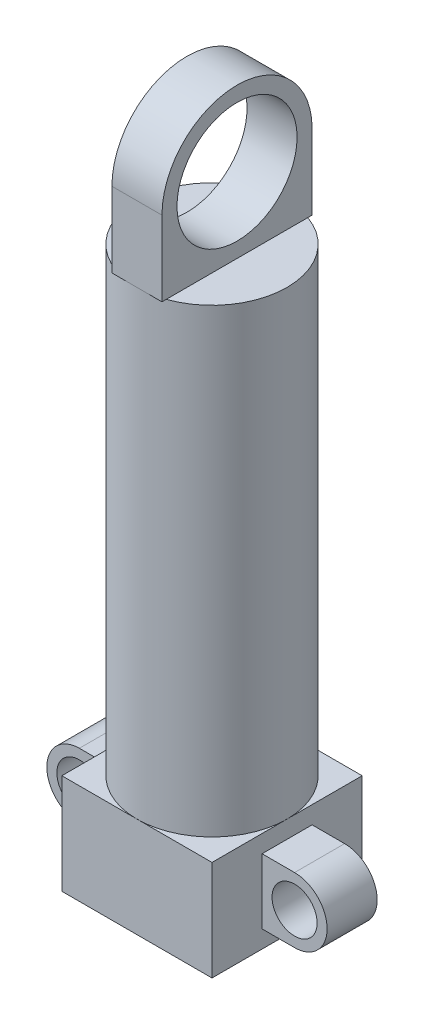
ISO-10303-21;
HEADER;
FILE_DESCRIPTION(('STEP AP214'),'2;1');
FILE_NAME('part.step','',(''),(''),'','','');
FILE_SCHEMA(('AUTOMOTIVE_DESIGN { 1 0 10303 214 1 1 1 1 }'));
ENDSEC;
DATA;
#1=APPLICATION_CONTEXT('core data for automotive mechanical design processes');
#2=APPLICATION_PROTOCOL_DEFINITION('international standard','automotive_design',2000,#1);
#3=PRODUCT_CONTEXT('',#1,'mechanical');
#4=PRODUCT('Part','Part','',(#3));
#5=PRODUCT_RELATED_PRODUCT_CATEGORY('part','',(#4));
#6=PRODUCT_DEFINITION_FORMATION('','',#4);
#7=PRODUCT_DEFINITION_CONTEXT('part definition',#1,'design');
#8=PRODUCT_DEFINITION('design','',#6,#7);
#9=PRODUCT_DEFINITION_SHAPE('','',#8);
#10=(LENGTH_UNIT() NAMED_UNIT(*) SI_UNIT(.MILLI.,.METRE.));
#11=(NAMED_UNIT(*) PLANE_ANGLE_UNIT() SI_UNIT($,.RADIAN.));
#12=(NAMED_UNIT(*) SI_UNIT($,.STERADIAN.) SOLID_ANGLE_UNIT());
#13=UNCERTAINTY_MEASURE_WITH_UNIT(LENGTH_MEASURE(1.E-05),#10,'distance_accuracy_value','');
#14=(GEOMETRIC_REPRESENTATION_CONTEXT(3) GLOBAL_UNCERTAINTY_ASSIGNED_CONTEXT((#13)) GLOBAL_UNIT_ASSIGNED_CONTEXT((#10,
#11,#12)) REPRESENTATION_CONTEXT('',''));
#15=CARTESIAN_POINT('',(0.,0.,0.));
#16=DIRECTION('',(0.,0.,1.));
#17=DIRECTION('',(1.,0.,0.));
#18=AXIS2_PLACEMENT_3D('',#15,#16,#17);
#19=CARTESIAN_POINT('',(0.,61.,-7.5));
#20=DIRECTION('',(0.,0.,1.));
#21=DIRECTION('',(1.,0.,0.));
#22=AXIS2_PLACEMENT_3D('',#19,#20,#21);
#23=PLANE('',#22);
#24=DIRECTION('',(0.,1.,0.));
#25=VECTOR('',#24,1.);
#26=CARTESIAN_POINT('',(2.5,0.,-7.5));
#27=LINE('',#26,#25);
#28=CARTESIAN_POINT('',(2.5,46.,-7.5));
#29=VERTEX_POINT('',#28);
#30=CARTESIAN_POINT('',(2.5,53.5,-7.5));
#31=VERTEX_POINT('',#30);
#32=EDGE_CURVE('E285',#29,#31,#27,.T.);
#33=ORIENTED_EDGE('',*,*,#32,.F.);
#34=DIRECTION('',(-1.,0.,0.));
#35=VECTOR('',#34,1.);
#36=CARTESIAN_POINT('',(0.,46.,-7.5));
#37=LINE('',#36,#35);
#38=CARTESIAN_POINT('',(0.,46.,-7.5));
#39=VERTEX_POINT('',#38);
#40=EDGE_CURVE('E309',#29,#39,#37,.T.);
#41=ORIENTED_EDGE('',*,*,#40,.T.);
#42=CARTESIAN_POINT('',(-2.5,46.,-7.5));
#43=VERTEX_POINT('',#42);
#44=EDGE_CURVE('E308',#39,#43,#37,.T.);
#45=ORIENTED_EDGE('',*,*,#44,.T.);
#46=DIRECTION('',(0.,-1.,0.));
#47=VECTOR('',#46,1.);
#48=CARTESIAN_POINT('',(-2.5,0.,-7.5));
#49=LINE('',#48,#47);
#50=CARTESIAN_POINT('',(-2.5,53.5,-7.5));
#51=VERTEX_POINT('',#50);
#52=EDGE_CURVE('E298',#51,#43,#49,.T.);
#53=ORIENTED_EDGE('',*,*,#52,.F.);
#54=DIRECTION('',(-1.,0.,0.));
#55=VECTOR('',#54,1.);
#56=CARTESIAN_POINT('',(7.5,53.5,-7.5));
#57=LINE('',#56,#55);
#58=EDGE_CURVE('E303',#31,#51,#57,.T.);
#59=ORIENTED_EDGE('',*,*,#58,.F.);
#60=EDGE_LOOP('',(#33,#41,#45,#53,#59));
#61=FACE_BOUND('',#60,.T.);
#62=ADVANCED_FACE('F64',(#61),#23,.F.);
#63=CARTESIAN_POINT('',(7.5,61.,7.5));
#64=DIRECTION('',(0.,0.,-1.));
#65=DIRECTION('',(-1.,0.,0.));
#66=AXIS2_PLACEMENT_3D('',#63,#64,#65);
#67=PLANE('',#66);
#68=DIRECTION('',(0.,-1.,0.));
#69=VECTOR('',#68,1.);
#70=CARTESIAN_POINT('',(2.5,0.,7.5));
#71=LINE('',#70,#69);
#72=CARTESIAN_POINT('',(2.5,53.5,7.5));
#73=VERTEX_POINT('',#72);
#74=CARTESIAN_POINT('',(2.5,46.,7.5));
#75=VERTEX_POINT('',#74);
#76=EDGE_CURVE('E279',#73,#75,#71,.T.);
#77=ORIENTED_EDGE('',*,*,#76,.F.);
#78=DIRECTION('',(-1.,0.,0.));
#79=VECTOR('',#78,1.);
#80=CARTESIAN_POINT('',(7.5,53.5,7.5));
#81=LINE('',#80,#79);
#82=CARTESIAN_POINT('',(-2.5,53.5,7.5));
#83=VERTEX_POINT('',#82);
#84=EDGE_CURVE('E301',#73,#83,#81,.T.);
#85=ORIENTED_EDGE('',*,*,#84,.T.);
#86=DIRECTION('',(0.,1.,0.));
#87=VECTOR('',#86,1.);
#88=CARTESIAN_POINT('',(-2.5,0.,7.5));
#89=LINE('',#88,#87);
#90=CARTESIAN_POINT('',(-2.5,46.,7.5));
#91=VERTEX_POINT('',#90);
#92=EDGE_CURVE('E291',#91,#83,#89,.T.);
#93=ORIENTED_EDGE('',*,*,#92,.F.);
#94=DIRECTION('',(1.,0.,0.));
#95=VECTOR('',#94,1.);
#96=CARTESIAN_POINT('',(7.5,46.,7.5));
#97=LINE('',#96,#95);
#98=CARTESIAN_POINT('',(0.,46.,7.5));
#99=VERTEX_POINT('',#98);
#100=EDGE_CURVE('E306',#91,#99,#97,.T.);
#101=ORIENTED_EDGE('',*,*,#100,.T.);
#102=EDGE_CURVE('E305',#99,#75,#97,.T.);
#103=ORIENTED_EDGE('',*,*,#102,.T.);
#104=EDGE_LOOP('',(#77,#85,#93,#101,#103));
#105=FACE_BOUND('',#104,.T.);
#106=ADVANCED_FACE('F385',(#105),#67,.F.);
#107=CARTESIAN_POINT('',(7.5,53.5,0.));
#108=DIRECTION('',(-1.,0.,0.));
#109=DIRECTION('',(0.,0.,1.));
#110=AXIS2_PLACEMENT_3D('',#107,#108,#109);
#111=CYLINDRICAL_SURFACE('',#110,7.5);
#112=ORIENTED_EDGE('',*,*,#84,.F.);
#113=CARTESIAN_POINT('',(2.5,53.5,0.));
#114=DIRECTION('',(1.,0.,0.));
#115=DIRECTION('',(0.,0.,-1.));
#116=AXIS2_PLACEMENT_3D('',#113,#114,#115);
#117=CIRCLE('',#116,7.5);
#118=EDGE_CURVE('E277',#31,#73,#117,.T.);
#119=ORIENTED_EDGE('',*,*,#118,.F.);
#120=ORIENTED_EDGE('',*,*,#58,.T.);
#121=CARTESIAN_POINT('',(-2.5,53.5,0.));
#122=DIRECTION('',(-1.,0.,0.));
#123=DIRECTION('',(0.,0.,1.));
#124=AXIS2_PLACEMENT_3D('',#121,#122,#123);
#125=CIRCLE('',#124,7.5);
#126=EDGE_CURVE('E295',#83,#51,#125,.T.);
#127=ORIENTED_EDGE('',*,*,#126,.F.);
#128=EDGE_LOOP('',(#112,#119,#120,#127));
#129=FACE_BOUND('',#128,.T.);
#130=ADVANCED_FACE('F366',(#129),#111,.T.);
#131=CARTESIAN_POINT('',(7.5,53.5,0.));
#132=DIRECTION('',(-1.,0.,0.));
#133=DIRECTION('',(0.,0.,1.));
#134=AXIS2_PLACEMENT_3D('',#131,#132,#133);
#135=CYLINDRICAL_SURFACE('',#134,6.);
#136=CARTESIAN_POINT('',(-2.5,53.5,0.));
#137=DIRECTION('',(-1.,0.,0.));
#138=DIRECTION('',(0.,0.,1.));
#139=AXIS2_PLACEMENT_3D('',#136,#137,#138);
#140=CIRCLE('',#139,6.);
#141=CARTESIAN_POINT('',(-2.5,53.5,6.));
#142=VERTEX_POINT('',#141);
#143=EDGE_CURVE('E300',#142,#142,#140,.F.);
#144=ORIENTED_EDGE('',*,*,#143,.F.);
#145=EDGE_LOOP('',(#144));
#146=FACE_BOUND('',#145,.T.);
#147=CARTESIAN_POINT('',(2.5,53.5,0.));
#148=DIRECTION('',(1.,0.,0.));
#149=DIRECTION('',(0.,0.,-1.));
#150=AXIS2_PLACEMENT_3D('',#147,#148,#149);
#151=CIRCLE('',#150,6.);
#152=CARTESIAN_POINT('',(2.5,53.5,-6.));
#153=VERTEX_POINT('',#152);
#154=EDGE_CURVE('E274',#153,#153,#151,.F.);
#155=ORIENTED_EDGE('',*,*,#154,.F.);
#156=EDGE_LOOP('',(#155));
#157=FACE_BOUND('',#156,.T.);
#158=ADVANCED_FACE('F362',(#146,#157),#135,.F.);
#159=CARTESIAN_POINT('',(0.,46.,0.));
#160=DIRECTION('',(0.,-1.,0.));
#161=DIRECTION('',(0.,0.,-1.));
#162=AXIS2_PLACEMENT_3D('',#159,#160,#161);
#163=PLANE('',#162);
#164=CARTESIAN_POINT('',(0.,46.,0.));
#165=DIRECTION('',(0.,1.,0.));
#166=DIRECTION('',(0.,0.,1.));
#167=AXIS2_PLACEMENT_3D('',#164,#165,#166);
#168=CIRCLE('',#167,7.5);
#169=CARTESIAN_POINT('',(2.5,46.,7.07106781186548));
#170=VERTEX_POINT('',#169);
#171=EDGE_CURVE('E72',#99,#170,#168,.T.);
#172=ORIENTED_EDGE('',*,*,#171,.T.);
#173=DIRECTION('',(0.,0.,-1.));
#174=VECTOR('',#173,1.);
#175=CARTESIAN_POINT('',(2.5,46.,0.));
#176=LINE('',#175,#174);
#177=EDGE_CURVE('E282',#75,#170,#176,.T.);
#178=ORIENTED_EDGE('',*,*,#177,.F.);
#179=ORIENTED_EDGE('',*,*,#102,.F.);
#180=EDGE_LOOP('',(#172,#178,#179));
#181=FACE_BOUND('',#180,.T.);
#182=ADVANCED_FACE('F365',(#181),#163,.T.);
#183=ORIENTED_EDGE('',*,*,#40,.F.);
#184=DIRECTION('',(0.,0.,1.));
#185=VECTOR('',#184,1.);
#186=CARTESIAN_POINT('',(2.5,46.,0.));
#187=LINE('',#186,#185);
#188=CARTESIAN_POINT('',(2.5,46.,-7.07106781186548));
#189=VERTEX_POINT('',#188);
#190=EDGE_CURVE('E12',#29,#189,#187,.T.);
#191=ORIENTED_EDGE('',*,*,#190,.T.);
#192=EDGE_CURVE('E352',#189,#39,#168,.T.);
#193=ORIENTED_EDGE('',*,*,#192,.T.);
#194=EDGE_LOOP('',(#183,#191,#193));
#195=FACE_BOUND('',#194,.T.);
#196=ADVANCED_FACE('F420',(#195),#163,.T.);
#197=CARTESIAN_POINT('',(-2.5,46.,-7.07106781186548));
#198=VERTEX_POINT('',#197);
#199=EDGE_CURVE('E401',#39,#198,#168,.T.);
#200=ORIENTED_EDGE('',*,*,#199,.T.);
#201=DIRECTION('',(0.,0.,1.));
#202=VECTOR('',#201,1.);
#203=CARTESIAN_POINT('',(-2.5,46.,0.));
#204=LINE('',#203,#202);
#205=EDGE_CURVE('E288',#43,#198,#204,.T.);
#206=ORIENTED_EDGE('',*,*,#205,.F.);
#207=ORIENTED_EDGE('',*,*,#44,.F.);
#208=EDGE_LOOP('',(#200,#206,#207));
#209=FACE_BOUND('',#208,.T.);
#210=ADVANCED_FACE('F399',(#209),#163,.T.);
#211=ORIENTED_EDGE('',*,*,#100,.F.);
#212=CARTESIAN_POINT('',(-2.5,46.,7.07106781186548));
#213=VERTEX_POINT('',#212);
#214=EDGE_CURVE('E287',#213,#91,#204,.T.);
#215=ORIENTED_EDGE('',*,*,#214,.F.);
#216=EDGE_CURVE('E355',#213,#99,#168,.T.);
#217=ORIENTED_EDGE('',*,*,#216,.T.);
#218=EDGE_LOOP('',(#211,#215,#217));
#219=FACE_BOUND('',#218,.T.);
#220=ADVANCED_FACE('F410',(#219),#163,.T.);
#221=CARTESIAN_POINT('',(0.,46.,0.));
#222=DIRECTION('',(0.,-1.,0.));
#223=DIRECTION('',(0.,0.,-1.));
#224=AXIS2_PLACEMENT_3D('',#221,#222,#223);
#225=CYLINDRICAL_SURFACE('',#224,7.5);
#226=ORIENTED_EDGE('',*,*,#171,.F.);
#227=ORIENTED_EDGE('',*,*,#216,.F.);
#228=EDGE_CURVE('E414',#198,#213,#168,.T.);
#229=ORIENTED_EDGE('',*,*,#228,.F.);
#230=ORIENTED_EDGE('',*,*,#199,.F.);
#231=ORIENTED_EDGE('',*,*,#192,.F.);
#232=EDGE_CURVE('E351',#170,#189,#168,.T.);
#233=ORIENTED_EDGE('',*,*,#232,.F.);
#234=EDGE_LOOP('',(#226,#227,#229,#230,#231,#233));
#235=FACE_BOUND('',#234,.T.);
#236=CARTESIAN_POINT('',(0.,0.,0.));
#237=DIRECTION('',(0.,1.,0.));
#238=DIRECTION('',(0.,0.,1.));
#239=AXIS2_PLACEMENT_3D('',#236,#237,#238);
#240=CIRCLE('',#239,7.5);
#241=CARTESIAN_POINT('',(0.,0.,7.5));
#242=VERTEX_POINT('',#241);
#243=CARTESIAN_POINT('',(7.5,0.,0.));
#244=VERTEX_POINT('',#243);
#245=EDGE_CURVE('E353',#242,#244,#240,.T.);
#246=ORIENTED_EDGE('',*,*,#245,.T.);
#247=CARTESIAN_POINT('',(0.,0.,-7.5));
#248=VERTEX_POINT('',#247);
#249=EDGE_CURVE('E356',#244,#248,#240,.T.);
#250=ORIENTED_EDGE('',*,*,#249,.T.);
#251=CARTESIAN_POINT('',(-7.5,0.,0.));
#252=VERTEX_POINT('',#251);
#253=EDGE_CURVE('E478',#248,#252,#240,.T.);
#254=ORIENTED_EDGE('',*,*,#253,.T.);
#255=EDGE_CURVE('E328',#252,#242,#240,.T.);
#256=ORIENTED_EDGE('',*,*,#255,.T.);
#257=EDGE_LOOP('',(#246,#250,#254,#256));
#258=FACE_BOUND('',#257,.T.);
#259=ADVANCED_FACE('F66',(#235,#258),#225,.T.);
#260=CARTESIAN_POINT('',(0.,0.,0.));
#261=DIRECTION('',(0.,-1.,0.));
#262=DIRECTION('',(0.,0.,-1.));
#263=AXIS2_PLACEMENT_3D('',#260,#261,#262);
#264=PLANE('',#263);
#265=ORIENTED_EDGE('',*,*,#245,.F.);
#266=DIRECTION('',(1.,0.,0.));
#267=VECTOR('',#266,1.);
#268=CARTESIAN_POINT('',(0.,0.,7.5));
#269=LINE('',#268,#267);
#270=CARTESIAN_POINT('',(7.5,0.,7.5));
#271=VERTEX_POINT('',#270);
#272=EDGE_CURVE('E311',#242,#271,#269,.T.);
#273=ORIENTED_EDGE('',*,*,#272,.T.);
#274=DIRECTION('',(0.,0.,-1.));
#275=VECTOR('',#274,1.);
#276=CARTESIAN_POINT('',(7.5,0.,0.));
#277=LINE('',#276,#275);
#278=EDGE_CURVE('E315',#271,#244,#277,.T.);
#279=ORIENTED_EDGE('',*,*,#278,.T.);
#280=EDGE_LOOP('',(#265,#273,#279));
#281=FACE_BOUND('',#280,.T.);
#282=ADVANCED_FACE('F447',(#281),#264,.F.);
#283=ORIENTED_EDGE('',*,*,#249,.F.);
#284=CARTESIAN_POINT('',(7.5,0.,-7.5));
#285=VERTEX_POINT('',#284);
#286=EDGE_CURVE('E322',#244,#285,#277,.T.);
#287=ORIENTED_EDGE('',*,*,#286,.T.);
#288=DIRECTION('',(-1.,0.,0.));
#289=VECTOR('',#288,1.);
#290=CARTESIAN_POINT('',(0.,0.,-7.5));
#291=LINE('',#290,#289);
#292=EDGE_CURVE('E319',#285,#248,#291,.T.);
#293=ORIENTED_EDGE('',*,*,#292,.T.);
#294=EDGE_LOOP('',(#283,#287,#293));
#295=FACE_BOUND('',#294,.T.);
#296=ADVANCED_FACE('F489',(#295),#264,.F.);
#297=ORIENTED_EDGE('',*,*,#253,.F.);
#298=CARTESIAN_POINT('',(-7.5,0.,-7.5));
#299=VERTEX_POINT('',#298);
#300=EDGE_CURVE('E323',#248,#299,#291,.T.);
#301=ORIENTED_EDGE('',*,*,#300,.T.);
#302=DIRECTION('',(0.,0.,1.));
#303=VECTOR('',#302,1.);
#304=CARTESIAN_POINT('',(-7.5,0.,-7.5));
#305=LINE('',#304,#303);
#306=EDGE_CURVE('E333',#299,#252,#305,.T.);
#307=ORIENTED_EDGE('',*,*,#306,.T.);
#308=EDGE_LOOP('',(#297,#301,#307));
#309=FACE_BOUND('',#308,.T.);
#310=ADVANCED_FACE('F448',(#309),#264,.F.);
#311=CARTESIAN_POINT('',(7.5,-10.,0.));
#312=DIRECTION('',(1.,0.,0.));
#313=DIRECTION('',(0.,0.,-1.));
#314=AXIS2_PLACEMENT_3D('',#311,#312,#313);
#315=PLANE('',#314);
#316=DIRECTION('',(0.,-1.,0.));
#317=VECTOR('',#316,1.);
#318=CARTESIAN_POINT('',(7.5,0.,-2.5));
#319=LINE('',#318,#317);
#320=CARTESIAN_POINT('',(7.5,-1.75,-2.5));
#321=VERTEX_POINT('',#320);
#322=CARTESIAN_POINT('',(7.5,-8.25,-2.5));
#323=VERTEX_POINT('',#322);
#324=EDGE_CURVE('E220',#321,#323,#319,.T.);
#325=ORIENTED_EDGE('',*,*,#324,.T.);
#326=DIRECTION('',(0.,0.,1.));
#327=VECTOR('',#326,1.);
#328=CARTESIAN_POINT('',(7.5,-8.25,-2.5));
#329=LINE('',#328,#327);
#330=CARTESIAN_POINT('',(7.5,-8.25,2.5));
#331=VERTEX_POINT('',#330);
#332=EDGE_CURVE('E216',#323,#331,#329,.T.);
#333=ORIENTED_EDGE('',*,*,#332,.T.);
#334=DIRECTION('',(0.,-1.,0.));
#335=VECTOR('',#334,1.);
#336=CARTESIAN_POINT('',(7.5,0.,2.5));
#337=LINE('',#336,#335);
#338=CARTESIAN_POINT('',(7.5,-1.75,2.5));
#339=VERTEX_POINT('',#338);
#340=EDGE_CURVE('E839',#339,#331,#337,.T.);
#341=ORIENTED_EDGE('',*,*,#340,.F.);
#342=DIRECTION('',(0.,0.,1.));
#343=VECTOR('',#342,1.);
#344=CARTESIAN_POINT('',(7.5,-1.75,-2.5));
#345=LINE('',#344,#343);
#346=EDGE_CURVE('E237',#321,#339,#345,.T.);
#347=ORIENTED_EDGE('',*,*,#346,.F.);
#348=EDGE_LOOP('',(#325,#333,#341,#347));
#349=FACE_BOUND('',#348,.T.);
#350=ORIENTED_EDGE('',*,*,#278,.F.);
#351=DIRECTION('',(0.,1.,0.));
#352=VECTOR('',#351,1.);
#353=CARTESIAN_POINT('',(7.5,-10.,7.5));
#354=LINE('',#353,#352);
#355=CARTESIAN_POINT('',(7.5,-10.,7.5));
#356=VERTEX_POINT('',#355);
#357=EDGE_CURVE('E335',#356,#271,#354,.T.);
#358=ORIENTED_EDGE('',*,*,#357,.F.);
#359=DIRECTION('',(0.,0.,-1.));
#360=VECTOR('',#359,1.);
#361=CARTESIAN_POINT('',(7.5,-10.,0.));
#362=LINE('',#361,#360);
#363=CARTESIAN_POINT('',(7.5,-10.,-7.5));
#364=VERTEX_POINT('',#363);
#365=EDGE_CURVE('E314',#356,#364,#362,.T.);
#366=ORIENTED_EDGE('',*,*,#365,.T.);
#367=DIRECTION('',(0.,1.,0.));
#368=VECTOR('',#367,1.);
#369=CARTESIAN_POINT('',(7.5,-10.,-7.5));
#370=LINE('',#369,#368);
#371=EDGE_CURVE('E318',#364,#285,#370,.T.);
#372=ORIENTED_EDGE('',*,*,#371,.T.);
#373=ORIENTED_EDGE('',*,*,#286,.F.);
#374=EDGE_LOOP('',(#350,#358,#366,#372,#373));
#375=FACE_BOUND('',#374,.T.);
#376=ADVANCED_FACE('F445',(#349,#375),#315,.T.);
#377=ORIENTED_EDGE('',*,*,#255,.F.);
#378=CARTESIAN_POINT('',(-7.5,0.,7.5));
#379=VERTEX_POINT('',#378);
#380=EDGE_CURVE('E338',#252,#379,#305,.T.);
#381=ORIENTED_EDGE('',*,*,#380,.T.);
#382=EDGE_CURVE('E336',#379,#242,#269,.T.);
#383=ORIENTED_EDGE('',*,*,#382,.T.);
#384=EDGE_LOOP('',(#377,#381,#383));
#385=FACE_BOUND('',#384,.T.);
#386=ADVANCED_FACE('F442',(#385),#264,.F.);
#387=CARTESIAN_POINT('',(0.,-10.,-7.5));
#388=DIRECTION('',(0.,0.,-1.));
#389=DIRECTION('',(-1.,0.,0.));
#390=AXIS2_PLACEMENT_3D('',#387,#388,#389);
#391=PLANE('',#390);
#392=ORIENTED_EDGE('',*,*,#292,.F.);
#393=ORIENTED_EDGE('',*,*,#371,.F.);
#394=DIRECTION('',(-1.,0.,0.));
#395=VECTOR('',#394,1.);
#396=CARTESIAN_POINT('',(0.,-10.,-7.5));
#397=LINE('',#396,#395);
#398=CARTESIAN_POINT('',(-7.5,-10.,-7.5));
#399=VERTEX_POINT('',#398);
#400=EDGE_CURVE('E312',#364,#399,#397,.T.);
#401=ORIENTED_EDGE('',*,*,#400,.T.);
#402=DIRECTION('',(0.,1.,0.));
#403=VECTOR('',#402,1.);
#404=CARTESIAN_POINT('',(-7.5,-10.,-7.5));
#405=LINE('',#404,#403);
#406=EDGE_CURVE('E344',#399,#299,#405,.T.);
#407=ORIENTED_EDGE('',*,*,#406,.T.);
#408=ORIENTED_EDGE('',*,*,#300,.F.);
#409=EDGE_LOOP('',(#392,#393,#401,#407,#408));
#410=FACE_BOUND('',#409,.T.);
#411=ADVANCED_FACE('F440',(#410),#391,.T.);
#412=CARTESIAN_POINT('',(0.,-10.,0.));
#413=DIRECTION('',(0.,-1.,0.));
#414=DIRECTION('',(0.,0.,-1.));
#415=AXIS2_PLACEMENT_3D('',#412,#413,#414);
#416=PLANE('',#415);
#417=ORIENTED_EDGE('',*,*,#365,.F.);
#418=DIRECTION('',(1.,0.,0.));
#419=VECTOR('',#418,1.);
#420=CARTESIAN_POINT('',(-7.5,-10.,7.5));
#421=LINE('',#420,#419);
#422=CARTESIAN_POINT('',(-7.5,-10.,7.5));
#423=VERTEX_POINT('',#422);
#424=EDGE_CURVE('E329',#423,#356,#421,.T.);
#425=ORIENTED_EDGE('',*,*,#424,.F.);
#426=DIRECTION('',(0.,0.,1.));
#427=VECTOR('',#426,1.);
#428=CARTESIAN_POINT('',(-7.5,-10.,-7.5));
#429=LINE('',#428,#427);
#430=EDGE_CURVE('E332',#399,#423,#429,.T.);
#431=ORIENTED_EDGE('',*,*,#430,.F.);
#432=ORIENTED_EDGE('',*,*,#400,.F.);
#433=EDGE_LOOP('',(#417,#425,#431,#432));
#434=FACE_BOUND('',#433,.T.);
#435=ADVANCED_FACE('F436',(#434),#416,.T.);
#436=CARTESIAN_POINT('',(-7.5,-10.,-7.5));
#437=DIRECTION('',(-1.,0.,0.));
#438=DIRECTION('',(0.,0.,1.));
#439=AXIS2_PLACEMENT_3D('',#436,#437,#438);
#440=PLANE('',#439);
#441=DIRECTION('',(0.,1.,0.));
#442=VECTOR('',#441,1.);
#443=CARTESIAN_POINT('',(-7.5,0.,-2.5));
#444=LINE('',#443,#442);
#445=CARTESIAN_POINT('',(-7.5,-8.25,-2.5));
#446=VERTEX_POINT('',#445);
#447=CARTESIAN_POINT('',(-7.5,-1.75,-2.5));
#448=VERTEX_POINT('',#447);
#449=EDGE_CURVE('E241',#446,#448,#444,.T.);
#450=ORIENTED_EDGE('',*,*,#449,.T.);
#451=DIRECTION('',(0.,0.,1.));
#452=VECTOR('',#451,1.);
#453=CARTESIAN_POINT('',(-7.5,-1.75,-2.5));
#454=LINE('',#453,#452);
#455=CARTESIAN_POINT('',(-7.5,-1.75,2.5));
#456=VERTEX_POINT('',#455);
#457=EDGE_CURVE('E255',#448,#456,#454,.T.);
#458=ORIENTED_EDGE('',*,*,#457,.T.);
#459=DIRECTION('',(0.,1.,0.));
#460=VECTOR('',#459,1.);
#461=CARTESIAN_POINT('',(-7.5,0.,2.5));
#462=LINE('',#461,#460);
#463=CARTESIAN_POINT('',(-7.5,-8.25,2.5));
#464=VERTEX_POINT('',#463);
#465=EDGE_CURVE('E234',#464,#456,#462,.T.);
#466=ORIENTED_EDGE('',*,*,#465,.F.);
#467=DIRECTION('',(0.,0.,1.));
#468=VECTOR('',#467,1.);
#469=CARTESIAN_POINT('',(-7.5,-8.25,-2.5));
#470=LINE('',#469,#468);
#471=EDGE_CURVE('E272',#446,#464,#470,.T.);
#472=ORIENTED_EDGE('',*,*,#471,.F.);
#473=EDGE_LOOP('',(#450,#458,#466,#472));
#474=FACE_BOUND('',#473,.T.);
#475=DIRECTION('',(0.,1.,0.));
#476=VECTOR('',#475,1.);
#477=CARTESIAN_POINT('',(-7.5,-10.,7.5));
#478=LINE('',#477,#476);
#479=EDGE_CURVE('E341',#423,#379,#478,.T.);
#480=ORIENTED_EDGE('',*,*,#479,.T.);
#481=ORIENTED_EDGE('',*,*,#380,.F.);
#482=ORIENTED_EDGE('',*,*,#306,.F.);
#483=ORIENTED_EDGE('',*,*,#406,.F.);
#484=ORIENTED_EDGE('',*,*,#430,.T.);
#485=EDGE_LOOP('',(#480,#481,#482,#483,#484));
#486=FACE_BOUND('',#485,.T.);
#487=ADVANCED_FACE('F439',(#474,#486),#440,.T.);
#488=CARTESIAN_POINT('',(0.,-10.,7.5));
#489=DIRECTION('',(0.,0.,1.));
#490=DIRECTION('',(1.,0.,0.));
#491=AXIS2_PLACEMENT_3D('',#488,#489,#490);
#492=PLANE('',#491);
#493=ORIENTED_EDGE('',*,*,#357,.T.);
#494=ORIENTED_EDGE('',*,*,#272,.F.);
#495=ORIENTED_EDGE('',*,*,#382,.F.);
#496=ORIENTED_EDGE('',*,*,#479,.F.);
#497=ORIENTED_EDGE('',*,*,#424,.T.);
#498=EDGE_LOOP('',(#493,#494,#495,#496,#497));
#499=FACE_BOUND('',#498,.T.);
#500=ADVANCED_FACE('F456',(#499),#492,.T.);
#501=CARTESIAN_POINT('',(-2.5,46.,0.));
#502=DIRECTION('',(0.,-1.,0.));
#503=DIRECTION('',(0.,0.,-1.));
#504=AXIS2_PLACEMENT_3D('',#501,#502,#503);
#505=PLANE('',#504);
#506=EDGE_CURVE('E292',#198,#213,#204,.T.);
#507=ORIENTED_EDGE('',*,*,#506,.F.);
#508=ORIENTED_EDGE('',*,*,#228,.T.);
#509=EDGE_LOOP('',(#507,#508));
#510=FACE_BOUND('',#509,.T.);
#511=ADVANCED_FACE('F459',(#510),#505,.F.);
#512=CARTESIAN_POINT('',(-2.5,0.,0.));
#513=DIRECTION('',(-1.,0.,0.));
#514=DIRECTION('',(0.,0.,1.));
#515=AXIS2_PLACEMENT_3D('',#512,#513,#514);
#516=PLANE('',#515);
#517=ORIENTED_EDGE('',*,*,#205,.T.);
#518=ORIENTED_EDGE('',*,*,#506,.T.);
#519=ORIENTED_EDGE('',*,*,#214,.T.);
#520=ORIENTED_EDGE('',*,*,#92,.T.);
#521=ORIENTED_EDGE('',*,*,#126,.T.);
#522=ORIENTED_EDGE('',*,*,#52,.T.);
#523=EDGE_LOOP('',(#517,#518,#519,#520,#521,#522));
#524=FACE_BOUND('',#523,.T.);
#525=ORIENTED_EDGE('',*,*,#143,.T.);
#526=EDGE_LOOP('',(#525));
#527=FACE_BOUND('',#526,.T.);
#528=ADVANCED_FACE('F360',(#524,#527),#516,.T.);
#529=CARTESIAN_POINT('',(2.5,46.,0.));
#530=DIRECTION('',(0.,-1.,0.));
#531=DIRECTION('',(0.,0.,-1.));
#532=AXIS2_PLACEMENT_3D('',#529,#530,#531);
#533=PLANE('',#532);
#534=EDGE_CURVE('E281',#170,#189,#176,.T.);
#535=ORIENTED_EDGE('',*,*,#534,.F.);
#536=ORIENTED_EDGE('',*,*,#232,.T.);
#537=EDGE_LOOP('',(#535,#536));
#538=FACE_BOUND('',#537,.T.);
#539=ADVANCED_FACE('F374',(#538),#533,.F.);
#540=CARTESIAN_POINT('',(2.5,0.,0.));
#541=DIRECTION('',(1.,0.,0.));
#542=DIRECTION('',(0.,0.,-1.));
#543=AXIS2_PLACEMENT_3D('',#540,#541,#542);
#544=PLANE('',#543);
#545=ORIENTED_EDGE('',*,*,#154,.T.);
#546=EDGE_LOOP('',(#545));
#547=FACE_BOUND('',#546,.T.);
#548=ORIENTED_EDGE('',*,*,#118,.T.);
#549=ORIENTED_EDGE('',*,*,#76,.T.);
#550=ORIENTED_EDGE('',*,*,#177,.T.);
#551=ORIENTED_EDGE('',*,*,#534,.T.);
#552=ORIENTED_EDGE('',*,*,#190,.F.);
#553=ORIENTED_EDGE('',*,*,#32,.T.);
#554=EDGE_LOOP('',(#548,#549,#550,#551,#552,#553));
#555=FACE_BOUND('',#554,.T.);
#556=ADVANCED_FACE('F370',(#547,#555),#544,.T.);
#557=CARTESIAN_POINT('',(0.,-8.25,-2.5));
#558=DIRECTION('',(0.,-1.,0.));
#559=DIRECTION('',(0.,0.,-1.));
#560=AXIS2_PLACEMENT_3D('',#557,#558,#559);
#561=PLANE('',#560);
#562=DIRECTION('',(1.,0.,0.));
#563=VECTOR('',#562,1.);
#564=CARTESIAN_POINT('',(0.,-8.25,2.5));
#565=LINE('',#564,#563);
#566=CARTESIAN_POINT('',(-10.75,-8.25,2.5));
#567=VERTEX_POINT('',#566);
#568=EDGE_CURVE('E87',#567,#464,#565,.T.);
#569=ORIENTED_EDGE('',*,*,#568,.F.);
#570=DIRECTION('',(0.,0.,1.));
#571=VECTOR('',#570,1.);
#572=CARTESIAN_POINT('',(-10.75,-8.25,-2.5));
#573=LINE('',#572,#571);
#574=CARTESIAN_POINT('',(-10.75,-8.25,-2.5));
#575=VERTEX_POINT('',#574);
#576=EDGE_CURVE('E270',#575,#567,#573,.T.);
#577=ORIENTED_EDGE('',*,*,#576,.F.);
#578=DIRECTION('',(1.,0.,0.));
#579=VECTOR('',#578,1.);
#580=CARTESIAN_POINT('',(0.,-8.25,-2.5));
#581=LINE('',#580,#579);
#582=EDGE_CURVE('E244',#575,#446,#581,.T.);
#583=ORIENTED_EDGE('',*,*,#582,.T.);
#584=ORIENTED_EDGE('',*,*,#471,.T.);
#585=EDGE_LOOP('',(#569,#577,#583,#584));
#586=FACE_BOUND('',#585,.T.);
#587=ADVANCED_FACE('F373',(#586),#561,.T.);
#588=CARTESIAN_POINT('',(-10.75,-5.,-2.5));
#589=DIRECTION('',(0.,0.,1.));
#590=DIRECTION('',(1.,0.,0.));
#591=AXIS2_PLACEMENT_3D('',#588,#589,#590);
#592=CYLINDRICAL_SURFACE('',#591,3.25);
#593=CARTESIAN_POINT('',(-10.75,-5.,2.5));
#594=DIRECTION('',(0.,0.,-1.));
#595=DIRECTION('',(-1.,0.,0.));
#596=AXIS2_PLACEMENT_3D('',#593,#594,#595);
#597=CIRCLE('',#596,3.25);
#598=CARTESIAN_POINT('',(-10.75,-1.75,2.5));
#599=VERTEX_POINT('',#598);
#600=EDGE_CURVE('E258',#567,#599,#597,.T.);
#601=ORIENTED_EDGE('',*,*,#600,.T.);
#602=DIRECTION('',(0.,0.,1.));
#603=VECTOR('',#602,1.);
#604=CARTESIAN_POINT('',(-10.75,-1.75,-2.5));
#605=LINE('',#604,#603);
#606=CARTESIAN_POINT('',(-10.75,-1.75,-2.5));
#607=VERTEX_POINT('',#606);
#608=EDGE_CURVE('E268',#607,#599,#605,.T.);
#609=ORIENTED_EDGE('',*,*,#608,.F.);
#610=CARTESIAN_POINT('',(-10.75,-5.,-2.5));
#611=DIRECTION('',(0.,0.,-1.));
#612=DIRECTION('',(-1.,0.,0.));
#613=AXIS2_PLACEMENT_3D('',#610,#611,#612);
#614=CIRCLE('',#613,3.25);
#615=EDGE_CURVE('E248',#575,#607,#614,.T.);
#616=ORIENTED_EDGE('',*,*,#615,.F.);
#617=ORIENTED_EDGE('',*,*,#576,.T.);
#618=EDGE_LOOP('',(#601,#609,#616,#617));
#619=FACE_BOUND('',#618,.T.);
#620=ADVANCED_FACE('F555',(#619),#592,.T.);
#621=CARTESIAN_POINT('',(0.,-1.75,-2.5));
#622=DIRECTION('',(0.,1.,0.));
#623=DIRECTION('',(0.,0.,1.));
#624=AXIS2_PLACEMENT_3D('',#621,#622,#623);
#625=PLANE('',#624);
#626=DIRECTION('',(-1.,0.,0.));
#627=VECTOR('',#626,1.);
#628=CARTESIAN_POINT('',(0.,-1.75,2.5));
#629=LINE('',#628,#627);
#630=EDGE_CURVE('E261',#456,#599,#629,.T.);
#631=ORIENTED_EDGE('',*,*,#630,.F.);
#632=ORIENTED_EDGE('',*,*,#457,.F.);
#633=DIRECTION('',(-1.,0.,0.));
#634=VECTOR('',#633,1.);
#635=CARTESIAN_POINT('',(0.,-1.75,-2.5));
#636=LINE('',#635,#634);
#637=EDGE_CURVE('E250',#448,#607,#636,.T.);
#638=ORIENTED_EDGE('',*,*,#637,.T.);
#639=ORIENTED_EDGE('',*,*,#608,.T.);
#640=EDGE_LOOP('',(#631,#632,#638,#639));
#641=FACE_BOUND('',#640,.T.);
#642=ADVANCED_FACE('F565',(#641),#625,.T.);
#643=CARTESIAN_POINT('',(-10.75,-5.,-2.5));
#644=DIRECTION('',(0.,0.,1.));
#645=DIRECTION('',(1.,0.,0.));
#646=AXIS2_PLACEMENT_3D('',#643,#644,#645);
#647=CYLINDRICAL_SURFACE('',#646,2.25);
#648=CARTESIAN_POINT('',(-10.75,-5.,-2.5));
#649=DIRECTION('',(0.,0.,-1.));
#650=DIRECTION('',(-1.,0.,0.));
#651=AXIS2_PLACEMENT_3D('',#648,#649,#650);
#652=CIRCLE('',#651,2.25);
#653=CARTESIAN_POINT('',(-13.,-5.,-2.5));
#654=VERTEX_POINT('',#653);
#655=EDGE_CURVE('E253',#654,#654,#652,.T.);
#656=ORIENTED_EDGE('',*,*,#655,.T.);
#657=EDGE_LOOP('',(#656));
#658=FACE_BOUND('',#657,.T.);
#659=CARTESIAN_POINT('',(-10.75,-5.,2.5));
#660=DIRECTION('',(0.,0.,-1.));
#661=DIRECTION('',(-1.,0.,0.));
#662=AXIS2_PLACEMENT_3D('',#659,#660,#661);
#663=CIRCLE('',#662,2.25);
#664=CARTESIAN_POINT('',(-13.,-5.,2.5));
#665=VERTEX_POINT('',#664);
#666=EDGE_CURVE('E245',#665,#665,#663,.T.);
#667=ORIENTED_EDGE('',*,*,#666,.F.);
#668=EDGE_LOOP('',(#667));
#669=FACE_BOUND('',#668,.T.);
#670=ADVANCED_FACE('F575',(#658,#669),#647,.F.);
#671=CARTESIAN_POINT('',(0.,0.,-2.5));
#672=DIRECTION('',(0.,0.,-1.));
#673=DIRECTION('',(-1.,0.,0.));
#674=AXIS2_PLACEMENT_3D('',#671,#672,#673);
#675=PLANE('',#674);
#676=ORIENTED_EDGE('',*,*,#449,.F.);
#677=ORIENTED_EDGE('',*,*,#582,.F.);
#678=ORIENTED_EDGE('',*,*,#615,.T.);
#679=ORIENTED_EDGE('',*,*,#637,.F.);
#680=EDGE_LOOP('',(#676,#677,#678,#679));
#681=FACE_BOUND('',#680,.T.);
#682=ORIENTED_EDGE('',*,*,#655,.F.);
#683=EDGE_LOOP('',(#682));
#684=FACE_BOUND('',#683,.T.);
#685=ADVANCED_FACE('F585',(#681,#684),#675,.T.);
#686=CARTESIAN_POINT('',(0.,0.,2.5));
#687=DIRECTION('',(0.,0.,-1.));
#688=DIRECTION('',(-1.,0.,0.));
#689=AXIS2_PLACEMENT_3D('',#686,#687,#688);
#690=PLANE('',#689);
#691=ORIENTED_EDGE('',*,*,#465,.T.);
#692=ORIENTED_EDGE('',*,*,#630,.T.);
#693=ORIENTED_EDGE('',*,*,#600,.F.);
#694=ORIENTED_EDGE('',*,*,#568,.T.);
#695=EDGE_LOOP('',(#691,#692,#693,#694));
#696=FACE_BOUND('',#695,.T.);
#697=ORIENTED_EDGE('',*,*,#666,.T.);
#698=EDGE_LOOP('',(#697));
#699=FACE_BOUND('',#698,.T.);
#700=ADVANCED_FACE('F596',(#696,#699),#690,.F.);
#701=CARTESIAN_POINT('',(10.75,-5.,-2.5));
#702=DIRECTION('',(0.,0.,1.));
#703=DIRECTION('',(1.,0.,0.));
#704=AXIS2_PLACEMENT_3D('',#701,#702,#703);
#705=CYLINDRICAL_SURFACE('',#704,3.25);
#706=CARTESIAN_POINT('',(10.75,-5.,2.5));
#707=DIRECTION('',(0.,0.,-1.));
#708=DIRECTION('',(-1.,0.,0.));
#709=AXIS2_PLACEMENT_3D('',#706,#707,#708);
#710=CIRCLE('',#709,3.25);
#711=CARTESIAN_POINT('',(10.75,-1.75,2.5));
#712=VERTEX_POINT('',#711);
#713=CARTESIAN_POINT('',(10.75,-8.25,2.5));
#714=VERTEX_POINT('',#713);
#715=EDGE_CURVE('E233',#712,#714,#710,.T.);
#716=ORIENTED_EDGE('',*,*,#715,.T.);
#717=DIRECTION('',(0.,0.,1.));
#718=VECTOR('',#717,1.);
#719=CARTESIAN_POINT('',(10.75,-8.25,-2.5));
#720=LINE('',#719,#718);
#721=CARTESIAN_POINT('',(10.75,-8.25,-2.5));
#722=VERTEX_POINT('',#721);
#723=EDGE_CURVE('E213',#722,#714,#720,.T.);
#724=ORIENTED_EDGE('',*,*,#723,.F.);
#725=CARTESIAN_POINT('',(10.75,-5.,-2.5));
#726=DIRECTION('',(0.,0.,-1.));
#727=DIRECTION('',(-1.,0.,0.));
#728=AXIS2_PLACEMENT_3D('',#725,#726,#727);
#729=CIRCLE('',#728,3.25);
#730=CARTESIAN_POINT('',(10.75,-1.75,-2.5));
#731=VERTEX_POINT('',#730);
#732=EDGE_CURVE('E221',#731,#722,#729,.T.);
#733=ORIENTED_EDGE('',*,*,#732,.F.);
#734=DIRECTION('',(0.,0.,1.));
#735=VECTOR('',#734,1.);
#736=CARTESIAN_POINT('',(10.75,-1.75,-2.5));
#737=LINE('',#736,#735);
#738=EDGE_CURVE('E843',#731,#712,#737,.T.);
#739=ORIENTED_EDGE('',*,*,#738,.T.);
#740=EDGE_LOOP('',(#716,#724,#733,#739));
#741=FACE_BOUND('',#740,.T.);
#742=ADVANCED_FACE('F232',(#741),#705,.T.);
#743=CARTESIAN_POINT('',(0.,-8.25,-2.5));
#744=DIRECTION('',(0.,1.,0.));
#745=DIRECTION('',(0.,0.,1.));
#746=AXIS2_PLACEMENT_3D('',#743,#744,#745);
#747=PLANE('',#746);
#748=DIRECTION('',(-1.,0.,0.));
#749=VECTOR('',#748,1.);
#750=CARTESIAN_POINT('',(0.,-8.25,2.5));
#751=LINE('',#750,#749);
#752=EDGE_CURVE('E847',#714,#331,#751,.T.);
#753=ORIENTED_EDGE('',*,*,#752,.T.);
#754=ORIENTED_EDGE('',*,*,#332,.F.);
#755=DIRECTION('',(-1.,0.,0.));
#756=VECTOR('',#755,1.);
#757=CARTESIAN_POINT('',(0.,-8.25,-2.5));
#758=LINE('',#757,#756);
#759=EDGE_CURVE('E209',#722,#323,#758,.T.);
#760=ORIENTED_EDGE('',*,*,#759,.F.);
#761=ORIENTED_EDGE('',*,*,#723,.T.);
#762=EDGE_LOOP('',(#753,#754,#760,#761));
#763=FACE_BOUND('',#762,.T.);
#764=ADVANCED_FACE('F211',(#763),#747,.F.);
#765=CARTESIAN_POINT('',(0.,-1.74999999999999,-2.5));
#766=DIRECTION('',(0.,-1.,0.));
#767=DIRECTION('',(1.,0.,0.));
#768=AXIS2_PLACEMENT_3D('',#765,#766,#767);
#769=PLANE('',#768);
#770=DIRECTION('',(1.,0.,0.));
#771=VECTOR('',#770,1.);
#772=CARTESIAN_POINT('',(0.,-1.74999999999999,2.5));
#773=LINE('',#772,#771);
#774=EDGE_CURVE('E79',#339,#712,#773,.T.);
#775=ORIENTED_EDGE('',*,*,#774,.T.);
#776=ORIENTED_EDGE('',*,*,#738,.F.);
#777=DIRECTION('',(1.,0.,0.));
#778=VECTOR('',#777,1.);
#779=CARTESIAN_POINT('',(0.,-1.74999999999999,-2.5));
#780=LINE('',#779,#778);
#781=EDGE_CURVE('E226',#321,#731,#780,.T.);
#782=ORIENTED_EDGE('',*,*,#781,.F.);
#783=ORIENTED_EDGE('',*,*,#346,.T.);
#784=EDGE_LOOP('',(#775,#776,#782,#783));
#785=FACE_BOUND('',#784,.T.);
#786=ADVANCED_FACE('F633',(#785),#769,.F.);
#787=CARTESIAN_POINT('',(10.75,-5.,-2.5));
#788=DIRECTION('',(0.,0.,1.));
#789=DIRECTION('',(1.,0.,0.));
#790=AXIS2_PLACEMENT_3D('',#787,#788,#789);
#791=CYLINDRICAL_SURFACE('',#790,2.25);
#792=CARTESIAN_POINT('',(10.75,-5.,-2.5));
#793=DIRECTION('',(0.,0.,-1.));
#794=DIRECTION('',(-1.,0.,0.));
#795=AXIS2_PLACEMENT_3D('',#792,#793,#794);
#796=CIRCLE('',#795,2.25);
#797=CARTESIAN_POINT('',(8.5,-5.,-2.5));
#798=VERTEX_POINT('',#797);
#799=EDGE_CURVE('E844',#798,#798,#796,.T.);
#800=ORIENTED_EDGE('',*,*,#799,.T.);
#801=EDGE_LOOP('',(#800));
#802=FACE_BOUND('',#801,.T.);
#803=CARTESIAN_POINT('',(10.75,-5.,2.5));
#804=DIRECTION('',(0.,0.,-1.));
#805=DIRECTION('',(-1.,0.,0.));
#806=AXIS2_PLACEMENT_3D('',#803,#804,#805);
#807=CIRCLE('',#806,2.25);
#808=CARTESIAN_POINT('',(8.5,-5.,2.5));
#809=VERTEX_POINT('',#808);
#810=EDGE_CURVE('E230',#809,#809,#807,.T.);
#811=ORIENTED_EDGE('',*,*,#810,.F.);
#812=EDGE_LOOP('',(#811));
#813=FACE_BOUND('',#812,.T.);
#814=ADVANCED_FACE('F642',(#802,#813),#791,.F.);
#815=CARTESIAN_POINT('',(0.,0.,-2.5));
#816=DIRECTION('',(0.,0.,-1.));
#817=DIRECTION('',(-1.,0.,0.));
#818=AXIS2_PLACEMENT_3D('',#815,#816,#817);
#819=PLANE('',#818);
#820=ORIENTED_EDGE('',*,*,#732,.T.);
#821=ORIENTED_EDGE('',*,*,#759,.T.);
#822=ORIENTED_EDGE('',*,*,#324,.F.);
#823=ORIENTED_EDGE('',*,*,#781,.T.);
#824=EDGE_LOOP('',(#820,#821,#822,#823));
#825=FACE_BOUND('',#824,.T.);
#826=ORIENTED_EDGE('',*,*,#799,.F.);
#827=EDGE_LOOP('',(#826));
#828=FACE_BOUND('',#827,.T.);
#829=ADVANCED_FACE('F224',(#825,#828),#819,.T.);
#830=CARTESIAN_POINT('',(0.,0.,2.5));
#831=DIRECTION('',(0.,0.,-1.));
#832=DIRECTION('',(-1.,0.,0.));
#833=AXIS2_PLACEMENT_3D('',#830,#831,#832);
#834=PLANE('',#833);
#835=ORIENTED_EDGE('',*,*,#715,.F.);
#836=ORIENTED_EDGE('',*,*,#774,.F.);
#837=ORIENTED_EDGE('',*,*,#340,.T.);
#838=ORIENTED_EDGE('',*,*,#752,.F.);
#839=EDGE_LOOP('',(#835,#836,#837,#838));
#840=FACE_BOUND('',#839,.T.);
#841=ORIENTED_EDGE('',*,*,#810,.T.);
#842=EDGE_LOOP('',(#841));
#843=FACE_BOUND('',#842,.T.);
#844=ADVANCED_FACE('F662',(#840,#843),#834,.F.);
#845=CLOSED_SHELL('',(#62,#106,#130,#158,#182,#196,#210,#220,#259,#282,#296,#310,#376,#386,#411,
#435,#487,#500,#511,#528,#539,#556,#587,#620,#642,#670,#685,#700,#742,#764,#786,#814,#829,#844));
#846=MANIFOLD_SOLID_BREP('B2',#845);
#847=ADVANCED_BREP_SHAPE_REPRESENTATION('',(#18,#846),#14);
#848=SHAPE_DEFINITION_REPRESENTATION(#9,#847);
ENDSEC;
END-ISO-10303-21;
